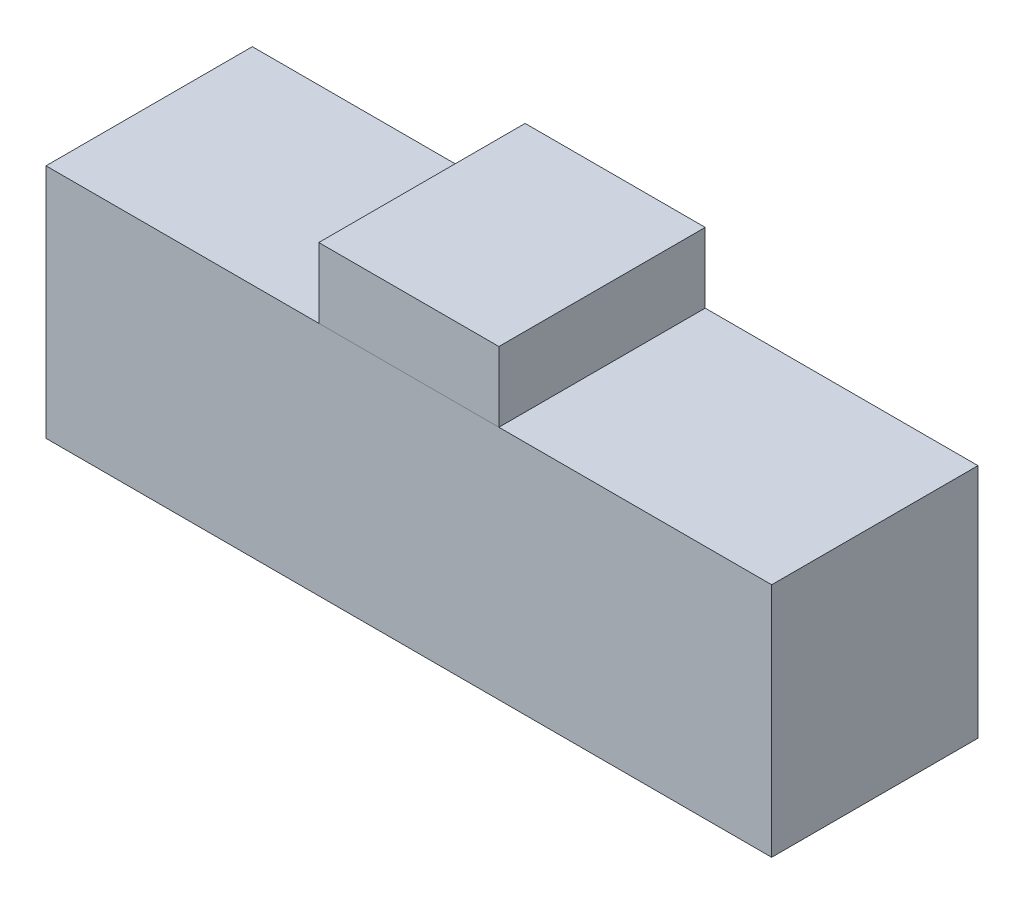
ISO-10303-21;
HEADER;
FILE_DESCRIPTION(('STEP AP214'),'2;1');
FILE_NAME('part.step','',(''),(''),'','','');
FILE_SCHEMA(('AUTOMOTIVE_DESIGN { 1 0 10303 214 1 1 1 1 }'));
ENDSEC;
DATA;
#1=APPLICATION_CONTEXT('core data for automotive mechanical design processes');
#2=APPLICATION_PROTOCOL_DEFINITION('international standard','automotive_design',2000,#1);
#3=PRODUCT_CONTEXT('',#1,'mechanical');
#4=PRODUCT('Part','Part','',(#3));
#5=PRODUCT_RELATED_PRODUCT_CATEGORY('part','',(#4));
#6=PRODUCT_DEFINITION_FORMATION('','',#4);
#7=PRODUCT_DEFINITION_CONTEXT('part definition',#1,'design');
#8=PRODUCT_DEFINITION('design','',#6,#7);
#9=PRODUCT_DEFINITION_SHAPE('','',#8);
#10=(LENGTH_UNIT() NAMED_UNIT(*) SI_UNIT(.MILLI.,.METRE.));
#11=(NAMED_UNIT(*) PLANE_ANGLE_UNIT() SI_UNIT($,.RADIAN.));
#12=(NAMED_UNIT(*) SI_UNIT($,.STERADIAN.) SOLID_ANGLE_UNIT());
#13=UNCERTAINTY_MEASURE_WITH_UNIT(LENGTH_MEASURE(1.E-05),#10,'distance_accuracy_value','');
#14=(GEOMETRIC_REPRESENTATION_CONTEXT(3) GLOBAL_UNCERTAINTY_ASSIGNED_CONTEXT((#13)) GLOBAL_UNIT_ASSIGNED_CONTEXT((#10,
#11,#12)) REPRESENTATION_CONTEXT('',''));
#15=CARTESIAN_POINT('',(0.,0.,0.));
#16=DIRECTION('',(0.,0.,1.));
#17=DIRECTION('',(1.,0.,0.));
#18=AXIS2_PLACEMENT_3D('',#15,#16,#17);
#19=CARTESIAN_POINT('',(65.786,44.45,29.972));
#20=DIRECTION('',(-1.,0.,0.));
#21=DIRECTION('',(0.,0.,1.));
#22=AXIS2_PLACEMENT_3D('',#19,#20,#21);
#23=PLANE('',#22);
#24=DIRECTION('',(0.,0.,-1.));
#25=VECTOR('',#24,1.);
#26=CARTESIAN_POINT('',(65.786,34.29,29.972));
#27=LINE('',#26,#25);
#28=CARTESIAN_POINT('',(65.786,34.29,29.972));
#29=VERTEX_POINT('',#28);
#30=CARTESIAN_POINT('',(65.786,34.29,0.));
#31=VERTEX_POINT('',#30);
#32=EDGE_CURVE('E110',#29,#31,#27,.T.);
#33=ORIENTED_EDGE('',*,*,#32,.T.);
#34=DIRECTION('',(0.,-1.,0.));
#35=VECTOR('',#34,1.);
#36=CARTESIAN_POINT('',(65.786,44.45,0.));
#37=LINE('',#36,#35);
#38=CARTESIAN_POINT('',(65.786,44.45,0.));
#39=VERTEX_POINT('',#38);
#40=EDGE_CURVE('E12',#39,#31,#37,.T.);
#41=ORIENTED_EDGE('',*,*,#40,.F.);
#42=DIRECTION('',(0.,0.,-1.));
#43=VECTOR('',#42,1.);
#44=CARTESIAN_POINT('',(65.786,44.45,29.972));
#45=LINE('',#44,#43);
#46=CARTESIAN_POINT('',(65.786,44.45,29.972));
#47=VERTEX_POINT('',#46);
#48=EDGE_CURVE('E98',#47,#39,#45,.T.);
#49=ORIENTED_EDGE('',*,*,#48,.F.);
#50=DIRECTION('',(0.,-1.,0.));
#51=VECTOR('',#50,1.);
#52=CARTESIAN_POINT('',(65.786,44.45,29.972));
#53=LINE('',#52,#51);
#54=EDGE_CURVE('E106',#47,#29,#53,.T.);
#55=ORIENTED_EDGE('',*,*,#54,.T.);
#56=EDGE_LOOP('',(#33,#41,#49,#55));
#57=FACE_BOUND('',#56,.T.);
#58=ADVANCED_FACE('F47',(#57),#23,.F.);
#59=CARTESIAN_POINT('',(65.786,44.45,0.));
#60=DIRECTION('',(0.,0.,1.));
#61=DIRECTION('',(1.,0.,0.));
#62=AXIS2_PLACEMENT_3D('',#59,#60,#61);
#63=PLANE('',#62);
#64=DIRECTION('',(-1.,0.,0.));
#65=VECTOR('',#64,1.);
#66=CARTESIAN_POINT('',(65.786,34.29,0.));
#67=LINE('',#66,#65);
#68=CARTESIAN_POINT('',(39.624,34.29,0.));
#69=VERTEX_POINT('',#68);
#70=EDGE_CURVE('E102',#31,#69,#67,.T.);
#71=ORIENTED_EDGE('',*,*,#70,.T.);
#72=DIRECTION('',(0.,-1.,0.));
#73=VECTOR('',#72,1.);
#74=CARTESIAN_POINT('',(39.624,44.45,0.));
#75=LINE('',#74,#73);
#76=CARTESIAN_POINT('',(39.624,44.45,0.));
#77=VERTEX_POINT('',#76);
#78=EDGE_CURVE('E55',#77,#69,#75,.T.);
#79=ORIENTED_EDGE('',*,*,#78,.F.);
#80=DIRECTION('',(-1.,0.,0.));
#81=VECTOR('',#80,1.);
#82=CARTESIAN_POINT('',(65.786,44.45,0.));
#83=LINE('',#82,#81);
#84=EDGE_CURVE('E93',#39,#77,#83,.T.);
#85=ORIENTED_EDGE('',*,*,#84,.F.);
#86=ORIENTED_EDGE('',*,*,#40,.T.);
#87=EDGE_LOOP('',(#71,#79,#85,#86));
#88=FACE_BOUND('',#87,.T.);
#89=ADVANCED_FACE('F101',(#88),#63,.F.);
#90=CARTESIAN_POINT('',(39.624,44.45,29.972));
#91=DIRECTION('',(1.,0.,0.));
#92=DIRECTION('',(0.,0.,-1.));
#93=AXIS2_PLACEMENT_3D('',#90,#91,#92);
#94=PLANE('',#93);
#95=DIRECTION('',(0.,0.,1.));
#96=VECTOR('',#95,1.);
#97=CARTESIAN_POINT('',(39.624,34.29,29.972));
#98=LINE('',#97,#96);
#99=CARTESIAN_POINT('',(39.624,34.29,29.972));
#100=VERTEX_POINT('',#99);
#101=EDGE_CURVE('E80',#69,#100,#98,.T.);
#102=ORIENTED_EDGE('',*,*,#101,.T.);
#103=DIRECTION('',(0.,-1.,0.));
#104=VECTOR('',#103,1.);
#105=CARTESIAN_POINT('',(39.624,44.45,29.972));
#106=LINE('',#105,#104);
#107=CARTESIAN_POINT('',(39.624,44.45,29.972));
#108=VERTEX_POINT('',#107);
#109=EDGE_CURVE('E103',#108,#100,#106,.T.);
#110=ORIENTED_EDGE('',*,*,#109,.F.);
#111=DIRECTION('',(0.,0.,1.));
#112=VECTOR('',#111,1.);
#113=CARTESIAN_POINT('',(39.624,44.45,29.972));
#114=LINE('',#113,#112);
#115=EDGE_CURVE('E96',#77,#108,#114,.T.);
#116=ORIENTED_EDGE('',*,*,#115,.F.);
#117=ORIENTED_EDGE('',*,*,#78,.T.);
#118=EDGE_LOOP('',(#102,#110,#116,#117));
#119=FACE_BOUND('',#118,.T.);
#120=ADVANCED_FACE('F104',(#119),#94,.F.);
#121=CARTESIAN_POINT('',(65.786,44.45,29.972));
#122=DIRECTION('',(0.,0.,-1.));
#123=DIRECTION('',(-1.,0.,0.));
#124=AXIS2_PLACEMENT_3D('',#121,#122,#123);
#125=PLANE('',#124);
#126=DIRECTION('',(1.,0.,0.));
#127=VECTOR('',#126,1.);
#128=CARTESIAN_POINT('',(65.786,34.29,29.972));
#129=LINE('',#128,#127);
#130=EDGE_CURVE('E86',#100,#29,#129,.T.);
#131=ORIENTED_EDGE('',*,*,#130,.T.);
#132=ORIENTED_EDGE('',*,*,#54,.F.);
#133=DIRECTION('',(1.,0.,0.));
#134=VECTOR('',#133,1.);
#135=CARTESIAN_POINT('',(65.786,44.45,29.972));
#136=LINE('',#135,#134);
#137=EDGE_CURVE('E63',#108,#47,#136,.T.);
#138=ORIENTED_EDGE('',*,*,#137,.F.);
#139=ORIENTED_EDGE('',*,*,#109,.T.);
#140=EDGE_LOOP('',(#131,#132,#138,#139));
#141=FACE_BOUND('',#140,.T.);
#142=ADVANCED_FACE('F117',(#141),#125,.F.);
#143=CARTESIAN_POINT('',(0.,44.45,0.));
#144=DIRECTION('',(0.,1.,0.));
#145=DIRECTION('',(0.,0.,1.));
#146=AXIS2_PLACEMENT_3D('',#143,#144,#145);
#147=PLANE('',#146);
#148=ORIENTED_EDGE('',*,*,#48,.T.);
#149=ORIENTED_EDGE('',*,*,#84,.T.);
#150=ORIENTED_EDGE('',*,*,#115,.T.);
#151=ORIENTED_EDGE('',*,*,#137,.T.);
#152=EDGE_LOOP('',(#148,#149,#150,#151));
#153=FACE_BOUND('',#152,.T.);
#154=ADVANCED_FACE('F94',(#153),#147,.T.);
#155=CARTESIAN_POINT('',(0.,34.29,0.));
#156=DIRECTION('',(0.,1.,0.));
#157=DIRECTION('',(0.,0.,1.));
#158=AXIS2_PLACEMENT_3D('',#155,#156,#157);
#159=PLANE('',#158);
#160=ORIENTED_EDGE('',*,*,#32,.F.);
#161=ORIENTED_EDGE('',*,*,#130,.F.);
#162=ORIENTED_EDGE('',*,*,#101,.F.);
#163=ORIENTED_EDGE('',*,*,#70,.F.);
#164=EDGE_LOOP('',(#160,#161,#162,#163));
#165=FACE_BOUND('',#164,.T.);
#166=ADVANCED_FACE('F120',(#165),#159,.F.);
#167=CLOSED_SHELL('',(#58,#89,#120,#142,#154,#166));
#168=MANIFOLD_SOLID_BREP('B2',#167);
#169=CARTESIAN_POINT('',(0.,0.,29.972));
#170=DIRECTION('',(1.,0.,0.));
#171=DIRECTION('',(0.,0.,-1.));
#172=AXIS2_PLACEMENT_3D('',#169,#170,#171);
#173=PLANE('',#172);
#174=DIRECTION('',(0.,-1.,0.));
#175=VECTOR('',#174,1.);
#176=CARTESIAN_POINT('',(0.,0.,0.));
#177=LINE('',#176,#175);
#178=CARTESIAN_POINT('',(0.,34.29,0.));
#179=VERTEX_POINT('',#178);
#180=CARTESIAN_POINT('',(0.,0.,0.));
#181=VERTEX_POINT('',#180);
#182=EDGE_CURVE('E234',#179,#181,#177,.T.);
#183=ORIENTED_EDGE('',*,*,#182,.T.);
#184=DIRECTION('',(0.,0.,-1.));
#185=VECTOR('',#184,1.);
#186=CARTESIAN_POINT('',(0.,0.,29.972));
#187=LINE('',#186,#185);
#188=CARTESIAN_POINT('',(0.,0.,29.972));
#189=VERTEX_POINT('',#188);
#190=EDGE_CURVE('E45',#189,#181,#187,.T.);
#191=ORIENTED_EDGE('',*,*,#190,.F.);
#192=DIRECTION('',(0.,-1.,0.));
#193=VECTOR('',#192,1.);
#194=CARTESIAN_POINT('',(0.,0.,29.972));
#195=LINE('',#194,#193);
#196=CARTESIAN_POINT('',(0.,34.29,29.972));
#197=VERTEX_POINT('',#196);
#198=EDGE_CURVE('E222',#197,#189,#195,.T.);
#199=ORIENTED_EDGE('',*,*,#198,.F.);
#200=DIRECTION('',(0.,0.,-1.));
#201=VECTOR('',#200,1.);
#202=CARTESIAN_POINT('',(0.,34.29,29.972));
#203=LINE('',#202,#201);
#204=EDGE_CURVE('E230',#197,#179,#203,.T.);
#205=ORIENTED_EDGE('',*,*,#204,.T.);
#206=EDGE_LOOP('',(#183,#191,#199,#205));
#207=FACE_BOUND('',#206,.T.);
#208=ADVANCED_FACE('F171',(#207),#173,.F.);
#209=CARTESIAN_POINT('',(0.,0.,29.972));
#210=DIRECTION('',(0.,1.,0.));
#211=DIRECTION('',(0.,0.,1.));
#212=AXIS2_PLACEMENT_3D('',#209,#210,#211);
#213=PLANE('',#212);
#214=DIRECTION('',(1.,0.,0.));
#215=VECTOR('',#214,1.);
#216=CARTESIAN_POINT('',(0.,0.,0.));
#217=LINE('',#216,#215);
#218=CARTESIAN_POINT('',(105.41,0.,0.));
#219=VERTEX_POINT('',#218);
#220=EDGE_CURVE('E226',#181,#219,#217,.T.);
#221=ORIENTED_EDGE('',*,*,#220,.T.);
#222=DIRECTION('',(0.,0.,-1.));
#223=VECTOR('',#222,1.);
#224=CARTESIAN_POINT('',(105.41,0.,29.972));
#225=LINE('',#224,#223);
#226=CARTESIAN_POINT('',(105.41,0.,29.972));
#227=VERTEX_POINT('',#226);
#228=EDGE_CURVE('E179',#227,#219,#225,.T.);
#229=ORIENTED_EDGE('',*,*,#228,.F.);
#230=DIRECTION('',(1.,0.,0.));
#231=VECTOR('',#230,1.);
#232=CARTESIAN_POINT('',(0.,0.,29.972));
#233=LINE('',#232,#231);
#234=EDGE_CURVE('E217',#189,#227,#233,.T.);
#235=ORIENTED_EDGE('',*,*,#234,.F.);
#236=ORIENTED_EDGE('',*,*,#190,.T.);
#237=EDGE_LOOP('',(#221,#229,#235,#236));
#238=FACE_BOUND('',#237,.T.);
#239=ADVANCED_FACE('F225',(#238),#213,.F.);
#240=CARTESIAN_POINT('',(105.41,0.,29.972));
#241=DIRECTION('',(-1.,0.,0.));
#242=DIRECTION('',(0.,0.,1.));
#243=AXIS2_PLACEMENT_3D('',#240,#241,#242);
#244=PLANE('',#243);
#245=DIRECTION('',(0.,1.,0.));
#246=VECTOR('',#245,1.);
#247=CARTESIAN_POINT('',(105.41,0.,0.));
#248=LINE('',#247,#246);
#249=CARTESIAN_POINT('',(105.41,34.29,0.));
#250=VERTEX_POINT('',#249);
#251=EDGE_CURVE('E204',#219,#250,#248,.T.);
#252=ORIENTED_EDGE('',*,*,#251,.T.);
#253=DIRECTION('',(0.,0.,-1.));
#254=VECTOR('',#253,1.);
#255=CARTESIAN_POINT('',(105.41,34.29,29.972));
#256=LINE('',#255,#254);
#257=CARTESIAN_POINT('',(105.41,34.29,29.972));
#258=VERTEX_POINT('',#257);
#259=EDGE_CURVE('E227',#258,#250,#256,.T.);
#260=ORIENTED_EDGE('',*,*,#259,.F.);
#261=DIRECTION('',(0.,1.,0.));
#262=VECTOR('',#261,1.);
#263=CARTESIAN_POINT('',(105.41,0.,29.972));
#264=LINE('',#263,#262);
#265=EDGE_CURVE('E220',#227,#258,#264,.T.);
#266=ORIENTED_EDGE('',*,*,#265,.F.);
#267=ORIENTED_EDGE('',*,*,#228,.T.);
#268=EDGE_LOOP('',(#252,#260,#266,#267));
#269=FACE_BOUND('',#268,.T.);
#270=ADVANCED_FACE('F228',(#269),#244,.F.);
#271=CARTESIAN_POINT('',(0.,34.29,29.972));
#272=DIRECTION('',(0.,-1.,0.));
#273=DIRECTION('',(0.,0.,-1.));
#274=AXIS2_PLACEMENT_3D('',#271,#272,#273);
#275=PLANE('',#274);
#276=DIRECTION('',(-1.,0.,0.));
#277=VECTOR('',#276,1.);
#278=CARTESIAN_POINT('',(0.,34.29,0.));
#279=LINE('',#278,#277);
#280=EDGE_CURVE('E210',#250,#179,#279,.T.);
#281=ORIENTED_EDGE('',*,*,#280,.T.);
#282=ORIENTED_EDGE('',*,*,#204,.F.);
#283=DIRECTION('',(-1.,0.,0.));
#284=VECTOR('',#283,1.);
#285=CARTESIAN_POINT('',(0.,34.29,29.972));
#286=LINE('',#285,#284);
#287=EDGE_CURVE('E187',#258,#197,#286,.T.);
#288=ORIENTED_EDGE('',*,*,#287,.F.);
#289=ORIENTED_EDGE('',*,*,#259,.T.);
#290=EDGE_LOOP('',(#281,#282,#288,#289));
#291=FACE_BOUND('',#290,.T.);
#292=ADVANCED_FACE('F241',(#291),#275,.F.);
#293=CARTESIAN_POINT('',(0.,0.,29.972));
#294=DIRECTION('',(0.,0.,-1.));
#295=DIRECTION('',(-1.,0.,0.));
#296=AXIS2_PLACEMENT_3D('',#293,#294,#295);
#297=PLANE('',#296);
#298=ORIENTED_EDGE('',*,*,#198,.T.);
#299=ORIENTED_EDGE('',*,*,#234,.T.);
#300=ORIENTED_EDGE('',*,*,#265,.T.);
#301=ORIENTED_EDGE('',*,*,#287,.T.);
#302=EDGE_LOOP('',(#298,#299,#300,#301));
#303=FACE_BOUND('',#302,.T.);
#304=ADVANCED_FACE('F218',(#303),#297,.F.);
#305=CARTESIAN_POINT('',(0.,0.,0.));
#306=DIRECTION('',(0.,0.,-1.));
#307=DIRECTION('',(-1.,0.,0.));
#308=AXIS2_PLACEMENT_3D('',#305,#306,#307);
#309=PLANE('',#308);
#310=ORIENTED_EDGE('',*,*,#182,.F.);
#311=ORIENTED_EDGE('',*,*,#280,.F.);
#312=ORIENTED_EDGE('',*,*,#251,.F.);
#313=ORIENTED_EDGE('',*,*,#220,.F.);
#314=EDGE_LOOP('',(#310,#311,#312,#313));
#315=FACE_BOUND('',#314,.T.);
#316=ADVANCED_FACE('F244',(#315),#309,.T.);
#317=CLOSED_SHELL('',(#208,#239,#270,#292,#304,#316));
#318=MANIFOLD_SOLID_BREP('B6',#317);
#319=ADVANCED_BREP_SHAPE_REPRESENTATION('',(#18,#168,#318),#14);
#320=SHAPE_DEFINITION_REPRESENTATION(#9,#319);
ENDSEC;
END-ISO-10303-21;
